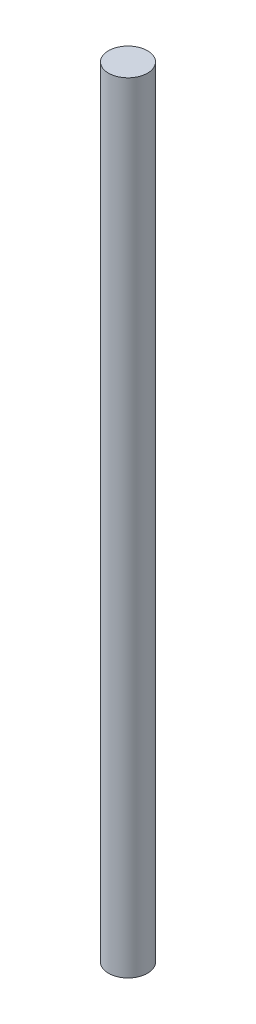
ISO-10303-21;
HEADER;
FILE_DESCRIPTION(('STEP AP214'),'2;1');
FILE_NAME('part.step','',(''),(''),'','','');
FILE_SCHEMA(('AUTOMOTIVE_DESIGN { 1 0 10303 214 1 1 1 1 }'));
ENDSEC;
DATA;
#1=APPLICATION_CONTEXT('core data for automotive mechanical design processes');
#2=APPLICATION_PROTOCOL_DEFINITION('international standard','automotive_design',2000,#1);
#3=PRODUCT_CONTEXT('',#1,'mechanical');
#4=PRODUCT('Part','Part','',(#3));
#5=PRODUCT_RELATED_PRODUCT_CATEGORY('part','',(#4));
#6=PRODUCT_DEFINITION_FORMATION('','',#4);
#7=PRODUCT_DEFINITION_CONTEXT('part definition',#1,'design');
#8=PRODUCT_DEFINITION('design','',#6,#7);
#9=PRODUCT_DEFINITION_SHAPE('','',#8);
#10=(LENGTH_UNIT() NAMED_UNIT(*) SI_UNIT(.MILLI.,.METRE.));
#11=(NAMED_UNIT(*) PLANE_ANGLE_UNIT() SI_UNIT($,.RADIAN.));
#12=(NAMED_UNIT(*) SI_UNIT($,.STERADIAN.) SOLID_ANGLE_UNIT());
#13=UNCERTAINTY_MEASURE_WITH_UNIT(LENGTH_MEASURE(1.E-05),#10,'distance_accuracy_value','');
#14=(GEOMETRIC_REPRESENTATION_CONTEXT(3) GLOBAL_UNCERTAINTY_ASSIGNED_CONTEXT((#13)) GLOBAL_UNIT_ASSIGNED_CONTEXT((#10,
#11,#12)) REPRESENTATION_CONTEXT('',''));
#15=CARTESIAN_POINT('',(0.,0.,0.));
#16=DIRECTION('',(0.,0.,1.));
#17=DIRECTION('',(1.,0.,0.));
#18=AXIS2_PLACEMENT_3D('',#15,#16,#17);
#19=CARTESIAN_POINT('',(0.,20.,0.));
#20=DIRECTION('',(0.,-1.,0.));
#21=DIRECTION('',(0.,0.,-1.));
#22=AXIS2_PLACEMENT_3D('',#19,#20,#21);
#23=CYLINDRICAL_SURFACE('',#22,1.);
#24=CARTESIAN_POINT('',(0.,20.,0.));
#25=DIRECTION('',(0.,1.,0.));
#26=DIRECTION('',(0.,0.,1.));
#27=AXIS2_PLACEMENT_3D('',#24,#25,#26);
#28=CIRCLE('',#27,1.);
#29=CARTESIAN_POINT('',(0.,20.,1.));
#30=VERTEX_POINT('',#29);
#31=EDGE_CURVE('E10',#30,#30,#28,.T.);
#32=ORIENTED_EDGE('',*,*,#31,.F.);
#33=EDGE_LOOP('',(#32));
#34=FACE_BOUND('',#33,.T.);
#35=CARTESIAN_POINT('',(0.,-20.,0.));
#36=DIRECTION('',(0.,1.,0.));
#37=DIRECTION('',(0.,0.,1.));
#38=AXIS2_PLACEMENT_3D('',#35,#36,#37);
#39=CIRCLE('',#38,1.);
#40=CARTESIAN_POINT('',(0.,-20.,1.));
#41=VERTEX_POINT('',#40);
#42=EDGE_CURVE('E34',#41,#41,#39,.T.);
#43=ORIENTED_EDGE('',*,*,#42,.T.);
#44=EDGE_LOOP('',(#43));
#45=FACE_BOUND('',#44,.T.);
#46=ADVANCED_FACE('F31',(#34,#45),#23,.T.);
#47=CARTESIAN_POINT('',(0.,20.,0.));
#48=DIRECTION('',(0.,1.,0.));
#49=DIRECTION('',(0.,0.,1.));
#50=AXIS2_PLACEMENT_3D('',#47,#48,#49);
#51=PLANE('',#50);
#52=ORIENTED_EDGE('',*,*,#31,.T.);
#53=EDGE_LOOP('',(#52));
#54=FACE_BOUND('',#53,.T.);
#55=ADVANCED_FACE('F46',(#54),#51,.T.);
#56=CARTESIAN_POINT('',(0.,-20.,0.));
#57=DIRECTION('',(0.,1.,0.));
#58=DIRECTION('',(0.,0.,1.));
#59=AXIS2_PLACEMENT_3D('',#56,#57,#58);
#60=PLANE('',#59);
#61=ORIENTED_EDGE('',*,*,#42,.F.);
#62=EDGE_LOOP('',(#61));
#63=FACE_BOUND('',#62,.T.);
#64=ADVANCED_FACE('F44',(#63),#60,.F.);
#65=CLOSED_SHELL('',(#46,#55,#64));
#66=MANIFOLD_SOLID_BREP('B2',#65);
#67=ADVANCED_BREP_SHAPE_REPRESENTATION('',(#18,#66),#14);
#68=SHAPE_DEFINITION_REPRESENTATION(#9,#67);
ENDSEC;
END-ISO-10303-21;
